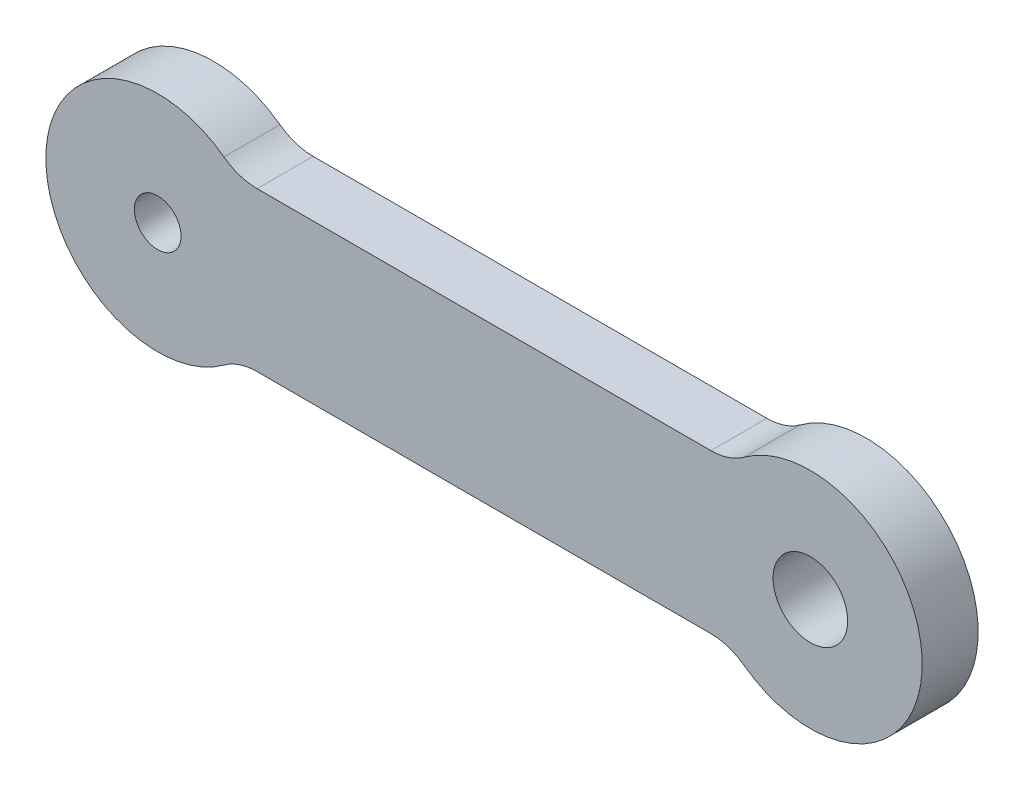
ISO-10303-21;
HEADER;
FILE_DESCRIPTION(('STEP AP214'),'2;1');
FILE_NAME('part.step','',(''),(''),'','','');
FILE_SCHEMA(('AUTOMOTIVE_DESIGN { 1 0 10303 214 1 1 1 1 }'));
ENDSEC;
DATA;
#1=APPLICATION_CONTEXT('core data for automotive mechanical design processes');
#2=APPLICATION_PROTOCOL_DEFINITION('international standard','automotive_design',2000,#1);
#3=PRODUCT_CONTEXT('',#1,'mechanical');
#4=PRODUCT('Part','Part','',(#3));
#5=PRODUCT_RELATED_PRODUCT_CATEGORY('part','',(#4));
#6=PRODUCT_DEFINITION_FORMATION('','',#4);
#7=PRODUCT_DEFINITION_CONTEXT('part definition',#1,'design');
#8=PRODUCT_DEFINITION('design','',#6,#7);
#9=PRODUCT_DEFINITION_SHAPE('','',#8);
#10=(LENGTH_UNIT() NAMED_UNIT(*) SI_UNIT(.MILLI.,.METRE.));
#11=(NAMED_UNIT(*) PLANE_ANGLE_UNIT() SI_UNIT($,.RADIAN.));
#12=(NAMED_UNIT(*) SI_UNIT($,.STERADIAN.) SOLID_ANGLE_UNIT());
#13=UNCERTAINTY_MEASURE_WITH_UNIT(LENGTH_MEASURE(1.E-05),#10,'distance_accuracy_value','');
#14=(GEOMETRIC_REPRESENTATION_CONTEXT(3) GLOBAL_UNCERTAINTY_ASSIGNED_CONTEXT((#13)) GLOBAL_UNIT_ASSIGNED_CONTEXT((#10,
#11,#12)) REPRESENTATION_CONTEXT('',''));
#15=CARTESIAN_POINT('',(0.,0.,0.));
#16=DIRECTION('',(0.,0.,1.));
#17=DIRECTION('',(1.,0.,0.));
#18=AXIS2_PLACEMENT_3D('',#15,#16,#17);
#19=CARTESIAN_POINT('',(5.33268225192539,7.25,3.));
#20=DIRECTION('',(0.,0.,-1.));
#21=DIRECTION('',(-1.,0.,0.));
#22=AXIS2_PLACEMENT_3D('',#19,#20,#21);
#23=PLANE('',#22);
#24=CARTESIAN_POINT('',(5.33268225192539,7.25,3.));
#25=DIRECTION('',(0.,0.,-1.));
#26=DIRECTION('',(-1.,0.,0.));
#27=AXIS2_PLACEMENT_3D('',#24,#25,#26);
#28=CIRCLE('',#27,3.);
#29=CARTESIAN_POINT('',(5.33268225192539,4.25,3.));
#30=VERTEX_POINT('',#29);
#31=CARTESIAN_POINT('',(3.55512150128359,4.83333333333333,3.));
#32=VERTEX_POINT('',#31);
#33=EDGE_CURVE('E151',#30,#32,#28,.T.);
#34=ORIENTED_EDGE('',*,*,#33,.T.);
#35=CARTESIAN_POINT('',(0.,0.,3.));
#36=DIRECTION('',(0.,0.,1.));
#37=DIRECTION('',(1.,0.,0.));
#38=AXIS2_PLACEMENT_3D('',#35,#36,#37);
#39=CIRCLE('',#38,6.);
#40=CARTESIAN_POINT('',(3.55512150128359,-4.83333333333333,3.));
#41=VERTEX_POINT('',#40);
#42=EDGE_CURVE('E99',#32,#41,#39,.T.);
#43=ORIENTED_EDGE('',*,*,#42,.T.);
#44=CARTESIAN_POINT('',(5.33268225192539,-7.25,3.));
#45=DIRECTION('',(0.,0.,-1.));
#46=DIRECTION('',(1.,0.,0.));
#47=AXIS2_PLACEMENT_3D('',#44,#45,#46);
#48=CIRCLE('',#47,3.);
#49=CARTESIAN_POINT('',(5.33268225192539,-4.25,3.));
#50=VERTEX_POINT('',#49);
#51=EDGE_CURVE('E166',#41,#50,#48,.T.);
#52=ORIENTED_EDGE('',*,*,#51,.T.);
#53=DIRECTION('',(1.,0.,0.));
#54=VECTOR('',#53,1.);
#55=CARTESIAN_POINT('',(29.6673177480746,-4.25,3.));
#56=LINE('',#55,#54);
#57=CARTESIAN_POINT('',(29.6673177480746,-4.25,3.));
#58=VERTEX_POINT('',#57);
#59=EDGE_CURVE('E179',#50,#58,#56,.T.);
#60=ORIENTED_EDGE('',*,*,#59,.T.);
#61=CARTESIAN_POINT('',(29.6673177480746,-7.25,3.));
#62=DIRECTION('',(0.,0.,-1.));
#63=DIRECTION('',(-1.,0.,0.));
#64=AXIS2_PLACEMENT_3D('',#61,#62,#63);
#65=CIRCLE('',#64,3.);
#66=CARTESIAN_POINT('',(31.4448784987164,-4.83333333333334,3.));
#67=VERTEX_POINT('',#66);
#68=EDGE_CURVE('E118',#58,#67,#65,.T.);
#69=ORIENTED_EDGE('',*,*,#68,.T.);
#70=CARTESIAN_POINT('',(35.,0.,3.));
#71=DIRECTION('',(0.,0.,1.));
#72=DIRECTION('',(-1.,0.,0.));
#73=AXIS2_PLACEMENT_3D('',#70,#71,#72);
#74=CIRCLE('',#73,6.);
#75=CARTESIAN_POINT('',(31.4448784987164,4.83333333333333,3.));
#76=VERTEX_POINT('',#75);
#77=EDGE_CURVE('E112',#67,#76,#74,.T.);
#78=ORIENTED_EDGE('',*,*,#77,.T.);
#79=CARTESIAN_POINT('',(29.6673177480746,7.25,3.));
#80=DIRECTION('',(0.,0.,-1.));
#81=DIRECTION('',(1.,0.,0.));
#82=AXIS2_PLACEMENT_3D('',#79,#80,#81);
#83=CIRCLE('',#82,3.);
#84=CARTESIAN_POINT('',(29.6673177480746,4.25,3.));
#85=VERTEX_POINT('',#84);
#86=EDGE_CURVE('E116',#76,#85,#83,.T.);
#87=ORIENTED_EDGE('',*,*,#86,.T.);
#88=DIRECTION('',(-1.,0.,0.));
#89=VECTOR('',#88,1.);
#90=CARTESIAN_POINT('',(29.6673177480746,4.25,3.));
#91=LINE('',#90,#89);
#92=EDGE_CURVE('E56',#85,#30,#91,.T.);
#93=ORIENTED_EDGE('',*,*,#92,.T.);
#94=EDGE_LOOP('',(#34,#43,#52,#60,#69,#78,#87,#93));
#95=FACE_BOUND('',#94,.T.);
#96=CARTESIAN_POINT('',(0.,0.,3.));
#97=DIRECTION('',(0.,0.,1.));
#98=DIRECTION('',(1.,0.,0.));
#99=AXIS2_PLACEMENT_3D('',#96,#97,#98);
#100=CIRCLE('',#99,1.25);
#101=CARTESIAN_POINT('',(1.25,0.,3.));
#102=VERTEX_POINT('',#101);
#103=EDGE_CURVE('E140',#102,#102,#100,.T.);
#104=ORIENTED_EDGE('',*,*,#103,.F.);
#105=EDGE_LOOP('',(#104));
#106=FACE_BOUND('',#105,.T.);
#107=CARTESIAN_POINT('',(35.,0.,3.));
#108=DIRECTION('',(0.,0.,1.));
#109=DIRECTION('',(1.,0.,0.));
#110=AXIS2_PLACEMENT_3D('',#107,#108,#109);
#111=CIRCLE('',#110,2.);
#112=CARTESIAN_POINT('',(37.,0.,3.));
#113=VERTEX_POINT('',#112);
#114=EDGE_CURVE('E188',#113,#113,#111,.T.);
#115=ORIENTED_EDGE('',*,*,#114,.F.);
#116=EDGE_LOOP('',(#115));
#117=FACE_BOUND('',#116,.T.);
#118=ADVANCED_FACE('F39',(#95,#106,#117),#23,.F.);
#119=CARTESIAN_POINT('',(5.33268225192539,7.25,0.));
#120=DIRECTION('',(0.,0.,-1.));
#121=DIRECTION('',(-1.,0.,0.));
#122=AXIS2_PLACEMENT_3D('',#119,#120,#121);
#123=PLANE('',#122);
#124=CARTESIAN_POINT('',(0.,0.,0.));
#125=DIRECTION('',(0.,0.,1.));
#126=DIRECTION('',(1.,0.,0.));
#127=AXIS2_PLACEMENT_3D('',#124,#125,#126);
#128=CIRCLE('',#127,1.25);
#129=CARTESIAN_POINT('',(1.25,0.,0.));
#130=VERTEX_POINT('',#129);
#131=EDGE_CURVE('E185',#130,#130,#128,.T.);
#132=ORIENTED_EDGE('',*,*,#131,.T.);
#133=EDGE_LOOP('',(#132));
#134=FACE_BOUND('',#133,.T.);
#135=CARTESIAN_POINT('',(5.33268225192539,7.25,0.));
#136=DIRECTION('',(0.,0.,-1.));
#137=DIRECTION('',(-1.,0.,0.));
#138=AXIS2_PLACEMENT_3D('',#135,#136,#137);
#139=CIRCLE('',#138,3.);
#140=CARTESIAN_POINT('',(5.33268225192539,4.25,0.));
#141=VERTEX_POINT('',#140);
#142=CARTESIAN_POINT('',(3.55512150128359,4.83333333333333,0.));
#143=VERTEX_POINT('',#142);
#144=EDGE_CURVE('E136',#141,#143,#139,.T.);
#145=ORIENTED_EDGE('',*,*,#144,.F.);
#146=DIRECTION('',(-1.,0.,0.));
#147=VECTOR('',#146,1.);
#148=CARTESIAN_POINT('',(29.6673177480746,4.25,0.));
#149=LINE('',#148,#147);
#150=CARTESIAN_POINT('',(29.6673177480746,4.25,0.));
#151=VERTEX_POINT('',#150);
#152=EDGE_CURVE('E91',#151,#141,#149,.T.);
#153=ORIENTED_EDGE('',*,*,#152,.F.);
#154=CARTESIAN_POINT('',(29.6673177480746,7.25,0.));
#155=DIRECTION('',(0.,0.,-1.));
#156=DIRECTION('',(1.,0.,0.));
#157=AXIS2_PLACEMENT_3D('',#154,#155,#156);
#158=CIRCLE('',#157,3.);
#159=CARTESIAN_POINT('',(31.4448784987164,4.83333333333333,0.));
#160=VERTEX_POINT('',#159);
#161=EDGE_CURVE('E85',#160,#151,#158,.T.);
#162=ORIENTED_EDGE('',*,*,#161,.F.);
#163=CARTESIAN_POINT('',(35.,0.,0.));
#164=DIRECTION('',(0.,0.,1.));
#165=DIRECTION('',(-1.,0.,0.));
#166=AXIS2_PLACEMENT_3D('',#163,#164,#165);
#167=CIRCLE('',#166,6.);
#168=CARTESIAN_POINT('',(31.4448784987164,-4.83333333333334,0.));
#169=VERTEX_POINT('',#168);
#170=EDGE_CURVE('E126',#169,#160,#167,.T.);
#171=ORIENTED_EDGE('',*,*,#170,.F.);
#172=CARTESIAN_POINT('',(29.6673177480746,-7.25,0.));
#173=DIRECTION('',(0.,0.,-1.));
#174=DIRECTION('',(-1.,0.,0.));
#175=AXIS2_PLACEMENT_3D('',#172,#173,#174);
#176=CIRCLE('',#175,3.);
#177=CARTESIAN_POINT('',(29.6673177480746,-4.25,0.));
#178=VERTEX_POINT('',#177);
#179=EDGE_CURVE('E146',#178,#169,#176,.T.);
#180=ORIENTED_EDGE('',*,*,#179,.F.);
#181=DIRECTION('',(1.,0.,0.));
#182=VECTOR('',#181,1.);
#183=CARTESIAN_POINT('',(29.6673177480746,-4.25,0.));
#184=LINE('',#183,#182);
#185=CARTESIAN_POINT('',(5.33268225192539,-4.25,0.));
#186=VERTEX_POINT('',#185);
#187=EDGE_CURVE('E144',#186,#178,#184,.T.);
#188=ORIENTED_EDGE('',*,*,#187,.F.);
#189=CARTESIAN_POINT('',(5.33268225192539,-7.25,0.));
#190=DIRECTION('',(0.,0.,-1.));
#191=DIRECTION('',(1.,0.,0.));
#192=AXIS2_PLACEMENT_3D('',#189,#190,#191);
#193=CIRCLE('',#192,3.);
#194=CARTESIAN_POINT('',(3.55512150128359,-4.83333333333333,0.));
#195=VERTEX_POINT('',#194);
#196=EDGE_CURVE('E142',#195,#186,#193,.T.);
#197=ORIENTED_EDGE('',*,*,#196,.F.);
#198=CARTESIAN_POINT('',(0.,0.,0.));
#199=DIRECTION('',(0.,0.,1.));
#200=DIRECTION('',(1.,0.,0.));
#201=AXIS2_PLACEMENT_3D('',#198,#199,#200);
#202=CIRCLE('',#201,6.);
#203=EDGE_CURVE('E139',#143,#195,#202,.T.);
#204=ORIENTED_EDGE('',*,*,#203,.F.);
#205=EDGE_LOOP('',(#145,#153,#162,#171,#180,#188,#197,#204));
#206=FACE_BOUND('',#205,.T.);
#207=CARTESIAN_POINT('',(35.,0.,0.));
#208=DIRECTION('',(0.,0.,1.));
#209=DIRECTION('',(1.,0.,0.));
#210=AXIS2_PLACEMENT_3D('',#207,#208,#209);
#211=CIRCLE('',#210,2.);
#212=CARTESIAN_POINT('',(37.,0.,0.));
#213=VERTEX_POINT('',#212);
#214=EDGE_CURVE('E191',#213,#213,#211,.T.);
#215=ORIENTED_EDGE('',*,*,#214,.T.);
#216=EDGE_LOOP('',(#215));
#217=FACE_BOUND('',#216,.T.);
#218=ADVANCED_FACE('F170',(#134,#206,#217),#123,.T.);
#219=CARTESIAN_POINT('',(5.33268225192539,7.25,3.));
#220=DIRECTION('',(0.,0.,-1.));
#221=DIRECTION('',(-1.,0.,0.));
#222=AXIS2_PLACEMENT_3D('',#219,#220,#221);
#223=CYLINDRICAL_SURFACE('',#222,3.);
#224=ORIENTED_EDGE('',*,*,#144,.T.);
#225=DIRECTION('',(0.,0.,-1.));
#226=VECTOR('',#225,1.);
#227=CARTESIAN_POINT('',(3.55512150128359,4.83333333333333,3.));
#228=LINE('',#227,#226);
#229=EDGE_CURVE('E11',#32,#143,#228,.T.);
#230=ORIENTED_EDGE('',*,*,#229,.F.);
#231=ORIENTED_EDGE('',*,*,#33,.F.);
#232=DIRECTION('',(0.,0.,-1.));
#233=VECTOR('',#232,1.);
#234=CARTESIAN_POINT('',(5.33268225192539,4.25,3.));
#235=LINE('',#234,#233);
#236=EDGE_CURVE('E132',#30,#141,#235,.T.);
#237=ORIENTED_EDGE('',*,*,#236,.T.);
#238=EDGE_LOOP('',(#224,#230,#231,#237));
#239=FACE_BOUND('',#238,.T.);
#240=ADVANCED_FACE('F41',(#239),#223,.F.);
#241=CARTESIAN_POINT('',(0.,0.,3.));
#242=DIRECTION('',(0.,0.,-1.));
#243=DIRECTION('',(-1.,0.,0.));
#244=AXIS2_PLACEMENT_3D('',#241,#242,#243);
#245=CYLINDRICAL_SURFACE('',#244,6.);
#246=ORIENTED_EDGE('',*,*,#203,.T.);
#247=DIRECTION('',(0.,0.,-1.));
#248=VECTOR('',#247,1.);
#249=CARTESIAN_POINT('',(3.55512150128359,-4.83333333333333,3.));
#250=LINE('',#249,#248);
#251=EDGE_CURVE('E48',#41,#195,#250,.T.);
#252=ORIENTED_EDGE('',*,*,#251,.F.);
#253=ORIENTED_EDGE('',*,*,#42,.F.);
#254=ORIENTED_EDGE('',*,*,#229,.T.);
#255=EDGE_LOOP('',(#246,#252,#253,#254));
#256=FACE_BOUND('',#255,.T.);
#257=ADVANCED_FACE('F223',(#256),#245,.T.);
#258=CARTESIAN_POINT('',(5.33268225192539,-7.25,3.));
#259=DIRECTION('',(0.,0.,-1.));
#260=DIRECTION('',(-1.,0.,0.));
#261=AXIS2_PLACEMENT_3D('',#258,#259,#260);
#262=CYLINDRICAL_SURFACE('',#261,3.);
#263=ORIENTED_EDGE('',*,*,#196,.T.);
#264=DIRECTION('',(0.,0.,-1.));
#265=VECTOR('',#264,1.);
#266=CARTESIAN_POINT('',(5.33268225192539,-4.25,3.));
#267=LINE('',#266,#265);
#268=EDGE_CURVE('E158',#50,#186,#267,.T.);
#269=ORIENTED_EDGE('',*,*,#268,.F.);
#270=ORIENTED_EDGE('',*,*,#51,.F.);
#271=ORIENTED_EDGE('',*,*,#251,.T.);
#272=EDGE_LOOP('',(#263,#269,#270,#271));
#273=FACE_BOUND('',#272,.T.);
#274=ADVANCED_FACE('F164',(#273),#262,.F.);
#275=CARTESIAN_POINT('',(29.6673177480746,-4.25,3.));
#276=DIRECTION('',(0.,1.,0.));
#277=DIRECTION('',(0.,0.,1.));
#278=AXIS2_PLACEMENT_3D('',#275,#276,#277);
#279=PLANE('',#278);
#280=ORIENTED_EDGE('',*,*,#187,.T.);
#281=DIRECTION('',(0.,0.,-1.));
#282=VECTOR('',#281,1.);
#283=CARTESIAN_POINT('',(29.6673177480746,-4.25,3.));
#284=LINE('',#283,#282);
#285=EDGE_CURVE('E155',#58,#178,#284,.T.);
#286=ORIENTED_EDGE('',*,*,#285,.F.);
#287=ORIENTED_EDGE('',*,*,#59,.F.);
#288=ORIENTED_EDGE('',*,*,#268,.T.);
#289=EDGE_LOOP('',(#280,#286,#287,#288));
#290=FACE_BOUND('',#289,.T.);
#291=ADVANCED_FACE('F175',(#290),#279,.F.);
#292=CARTESIAN_POINT('',(29.6673177480746,-7.25,3.));
#293=DIRECTION('',(0.,0.,-1.));
#294=DIRECTION('',(-1.,0.,0.));
#295=AXIS2_PLACEMENT_3D('',#292,#293,#294);
#296=CYLINDRICAL_SURFACE('',#295,3.);
#297=ORIENTED_EDGE('',*,*,#179,.T.);
#298=DIRECTION('',(0.,0.,-1.));
#299=VECTOR('',#298,1.);
#300=CARTESIAN_POINT('',(31.4448784987164,-4.83333333333334,3.));
#301=LINE('',#300,#299);
#302=EDGE_CURVE('E127',#67,#169,#301,.T.);
#303=ORIENTED_EDGE('',*,*,#302,.F.);
#304=ORIENTED_EDGE('',*,*,#68,.F.);
#305=ORIENTED_EDGE('',*,*,#285,.T.);
#306=EDGE_LOOP('',(#297,#303,#304,#305));
#307=FACE_BOUND('',#306,.T.);
#308=ADVANCED_FACE('F178',(#307),#296,.F.);
#309=CARTESIAN_POINT('',(35.,0.,3.));
#310=DIRECTION('',(0.,0.,-1.));
#311=DIRECTION('',(-1.,0.,0.));
#312=AXIS2_PLACEMENT_3D('',#309,#310,#311);
#313=CYLINDRICAL_SURFACE('',#312,6.);
#314=ORIENTED_EDGE('',*,*,#170,.T.);
#315=DIRECTION('',(0.,0.,-1.));
#316=VECTOR('',#315,1.);
#317=CARTESIAN_POINT('',(31.4448784987164,4.83333333333333,3.));
#318=LINE('',#317,#316);
#319=EDGE_CURVE('E123',#76,#160,#318,.T.);
#320=ORIENTED_EDGE('',*,*,#319,.F.);
#321=ORIENTED_EDGE('',*,*,#77,.F.);
#322=ORIENTED_EDGE('',*,*,#302,.T.);
#323=EDGE_LOOP('',(#314,#320,#321,#322));
#324=FACE_BOUND('',#323,.T.);
#325=ADVANCED_FACE('F124',(#324),#313,.T.);
#326=CARTESIAN_POINT('',(29.6673177480746,7.25,3.));
#327=DIRECTION('',(0.,0.,-1.));
#328=DIRECTION('',(-1.,0.,0.));
#329=AXIS2_PLACEMENT_3D('',#326,#327,#328);
#330=CYLINDRICAL_SURFACE('',#329,3.);
#331=ORIENTED_EDGE('',*,*,#161,.T.);
#332=DIRECTION('',(0.,0.,-1.));
#333=VECTOR('',#332,1.);
#334=CARTESIAN_POINT('',(29.6673177480746,4.25,3.));
#335=LINE('',#334,#333);
#336=EDGE_CURVE('E128',#85,#151,#335,.T.);
#337=ORIENTED_EDGE('',*,*,#336,.F.);
#338=ORIENTED_EDGE('',*,*,#86,.F.);
#339=ORIENTED_EDGE('',*,*,#319,.T.);
#340=EDGE_LOOP('',(#331,#337,#338,#339));
#341=FACE_BOUND('',#340,.T.);
#342=ADVANCED_FACE('F130',(#341),#330,.F.);
#343=CARTESIAN_POINT('',(29.6673177480746,4.25,3.));
#344=DIRECTION('',(0.,-1.,0.));
#345=DIRECTION('',(0.,0.,-1.));
#346=AXIS2_PLACEMENT_3D('',#343,#344,#345);
#347=PLANE('',#346);
#348=ORIENTED_EDGE('',*,*,#152,.T.);
#349=ORIENTED_EDGE('',*,*,#236,.F.);
#350=ORIENTED_EDGE('',*,*,#92,.F.);
#351=ORIENTED_EDGE('',*,*,#336,.T.);
#352=EDGE_LOOP('',(#348,#349,#350,#351));
#353=FACE_BOUND('',#352,.T.);
#354=ADVANCED_FACE('F211',(#353),#347,.F.);
#355=CARTESIAN_POINT('',(0.,0.,3.));
#356=DIRECTION('',(0.,0.,-1.));
#357=DIRECTION('',(-1.,0.,0.));
#358=AXIS2_PLACEMENT_3D('',#355,#356,#357);
#359=CYLINDRICAL_SURFACE('',#358,1.25);
#360=ORIENTED_EDGE('',*,*,#103,.T.);
#361=EDGE_LOOP('',(#360));
#362=FACE_BOUND('',#361,.T.);
#363=ORIENTED_EDGE('',*,*,#131,.F.);
#364=EDGE_LOOP('',(#363));
#365=FACE_BOUND('',#364,.T.);
#366=ADVANCED_FACE('F208',(#362,#365),#359,.F.);
#367=CARTESIAN_POINT('',(35.,0.,3.));
#368=DIRECTION('',(0.,0.,-1.));
#369=DIRECTION('',(-1.,0.,0.));
#370=AXIS2_PLACEMENT_3D('',#367,#368,#369);
#371=CYLINDRICAL_SURFACE('',#370,2.);
#372=ORIENTED_EDGE('',*,*,#114,.T.);
#373=EDGE_LOOP('',(#372));
#374=FACE_BOUND('',#373,.T.);
#375=ORIENTED_EDGE('',*,*,#214,.F.);
#376=EDGE_LOOP('',(#375));
#377=FACE_BOUND('',#376,.T.);
#378=ADVANCED_FACE('F197',(#374,#377),#371,.F.);
#379=CLOSED_SHELL('',(#118,#218,#240,#257,#274,#291,#308,#325,#342,#354,#366,#378));
#380=MANIFOLD_SOLID_BREP('B2',#379);
#381=ADVANCED_BREP_SHAPE_REPRESENTATION('',(#18,#380),#14);
#382=SHAPE_DEFINITION_REPRESENTATION(#9,#381);
ENDSEC;
END-ISO-10303-21;
